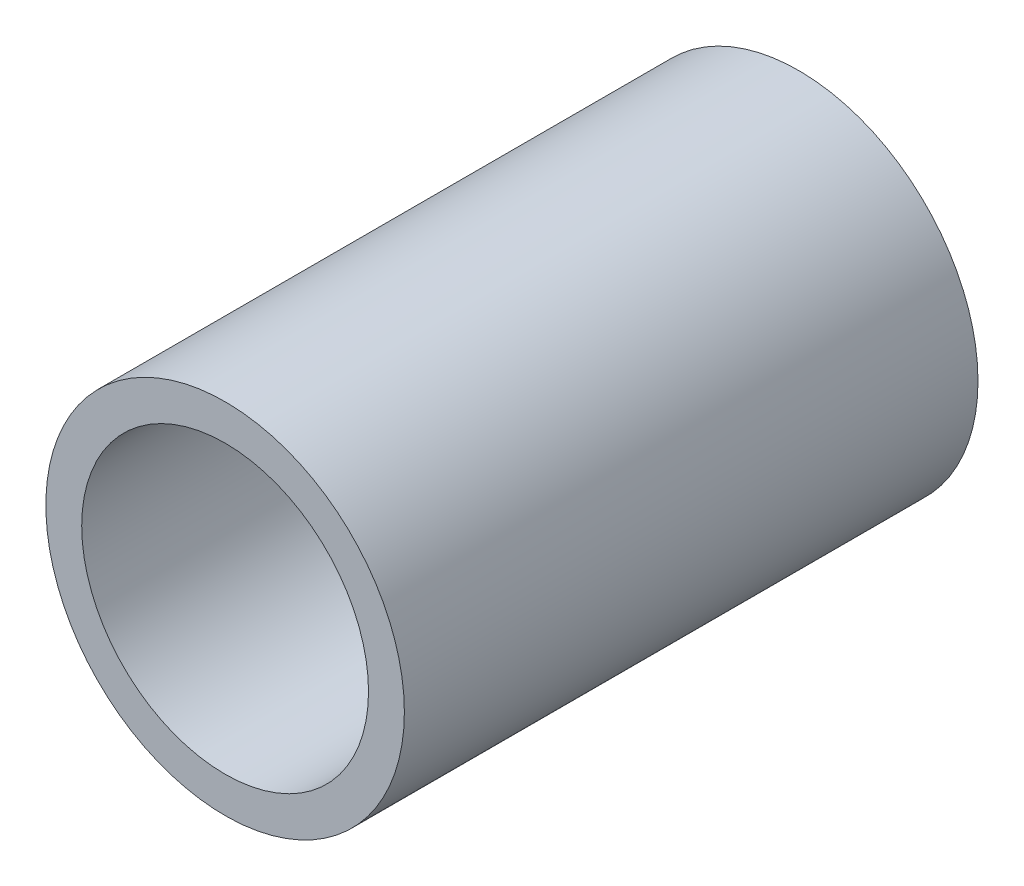
ISO-10303-21;
HEADER;
FILE_DESCRIPTION(('STEP AP214'),'2;1');
FILE_NAME('part.step','',(''),(''),'','','');
FILE_SCHEMA(('AUTOMOTIVE_DESIGN { 1 0 10303 214 1 1 1 1 }'));
ENDSEC;
DATA;
#1=APPLICATION_CONTEXT('core data for automotive mechanical design processes');
#2=APPLICATION_PROTOCOL_DEFINITION('international standard','automotive_design',2000,#1);
#3=PRODUCT_CONTEXT('',#1,'mechanical');
#4=PRODUCT('Part','Part','',(#3));
#5=PRODUCT_RELATED_PRODUCT_CATEGORY('part','',(#4));
#6=PRODUCT_DEFINITION_FORMATION('','',#4);
#7=PRODUCT_DEFINITION_CONTEXT('part definition',#1,'design');
#8=PRODUCT_DEFINITION('design','',#6,#7);
#9=PRODUCT_DEFINITION_SHAPE('','',#8);
#10=(LENGTH_UNIT() NAMED_UNIT(*) SI_UNIT(.MILLI.,.METRE.));
#11=(NAMED_UNIT(*) PLANE_ANGLE_UNIT() SI_UNIT($,.RADIAN.));
#12=(NAMED_UNIT(*) SI_UNIT($,.STERADIAN.) SOLID_ANGLE_UNIT());
#13=UNCERTAINTY_MEASURE_WITH_UNIT(LENGTH_MEASURE(1.E-05),#10,'distance_accuracy_value','');
#14=(GEOMETRIC_REPRESENTATION_CONTEXT(3) GLOBAL_UNCERTAINTY_ASSIGNED_CONTEXT((#13)) GLOBAL_UNIT_ASSIGNED_CONTEXT((#10,
#11,#12)) REPRESENTATION_CONTEXT('',''));
#15=CARTESIAN_POINT('',(0.,0.,0.));
#16=DIRECTION('',(0.,0.,1.));
#17=DIRECTION('',(1.,0.,0.));
#18=AXIS2_PLACEMENT_3D('',#15,#16,#17);
#19=CARTESIAN_POINT('',(0.,0.,12.));
#20=DIRECTION('',(0.,0.,1.));
#21=DIRECTION('',(1.,0.,0.));
#22=AXIS2_PLACEMENT_3D('',#19,#20,#21);
#23=PLANE('',#22);
#24=CARTESIAN_POINT('',(0.,0.,12.));
#25=DIRECTION('',(0.,0.,1.));
#26=DIRECTION('',(1.,0.,0.));
#27=AXIS2_PLACEMENT_3D('',#24,#25,#26);
#28=CIRCLE('',#27,7.5);
#29=CARTESIAN_POINT('',(7.5,0.,12.));
#30=VERTEX_POINT('',#29);
#31=EDGE_CURVE('E10',#30,#30,#28,.T.);
#32=ORIENTED_EDGE('',*,*,#31,.T.);
#33=EDGE_LOOP('',(#32));
#34=FACE_BOUND('',#33,.T.);
#35=CARTESIAN_POINT('',(0.,0.,12.));
#36=DIRECTION('',(0.,0.,1.));
#37=DIRECTION('',(1.,0.,0.));
#38=AXIS2_PLACEMENT_3D('',#35,#36,#37);
#39=CIRCLE('',#38,6.);
#40=CARTESIAN_POINT('',(6.,0.,12.));
#41=VERTEX_POINT('',#40);
#42=EDGE_CURVE('E50',#41,#41,#39,.T.);
#43=ORIENTED_EDGE('',*,*,#42,.F.);
#44=EDGE_LOOP('',(#43));
#45=FACE_BOUND('',#44,.T.);
#46=ADVANCED_FACE('F37',(#34,#45),#23,.T.);
#47=CARTESIAN_POINT('',(0.,0.,-12.));
#48=DIRECTION('',(0.,0.,1.));
#49=DIRECTION('',(1.,0.,0.));
#50=AXIS2_PLACEMENT_3D('',#47,#48,#49);
#51=PLANE('',#50);
#52=CARTESIAN_POINT('',(0.,0.,-12.));
#53=DIRECTION('',(0.,0.,1.));
#54=DIRECTION('',(1.,0.,0.));
#55=AXIS2_PLACEMENT_3D('',#52,#53,#54);
#56=CIRCLE('',#55,7.5);
#57=CARTESIAN_POINT('',(7.5,0.,-12.));
#58=VERTEX_POINT('',#57);
#59=EDGE_CURVE('E41',#58,#58,#56,.T.);
#60=ORIENTED_EDGE('',*,*,#59,.F.);
#61=EDGE_LOOP('',(#60));
#62=FACE_BOUND('',#61,.T.);
#63=CARTESIAN_POINT('',(0.,0.,-12.));
#64=DIRECTION('',(0.,0.,1.));
#65=DIRECTION('',(1.,0.,0.));
#66=AXIS2_PLACEMENT_3D('',#63,#64,#65);
#67=CIRCLE('',#66,6.);
#68=CARTESIAN_POINT('',(6.,0.,-12.));
#69=VERTEX_POINT('',#68);
#70=EDGE_CURVE('E52',#69,#69,#67,.T.);
#71=ORIENTED_EDGE('',*,*,#70,.T.);
#72=EDGE_LOOP('',(#71));
#73=FACE_BOUND('',#72,.T.);
#74=ADVANCED_FACE('F64',(#62,#73),#51,.F.);
#75=CARTESIAN_POINT('',(0.,0.,12.));
#76=DIRECTION('',(0.,0.,-1.));
#77=DIRECTION('',(-1.,0.,0.));
#78=AXIS2_PLACEMENT_3D('',#75,#76,#77);
#79=CYLINDRICAL_SURFACE('',#78,7.5);
#80=ORIENTED_EDGE('',*,*,#31,.F.);
#81=EDGE_LOOP('',(#80));
#82=FACE_BOUND('',#81,.T.);
#83=ORIENTED_EDGE('',*,*,#59,.T.);
#84=EDGE_LOOP('',(#83));
#85=FACE_BOUND('',#84,.T.);
#86=ADVANCED_FACE('F39',(#82,#85),#79,.T.);
#87=CARTESIAN_POINT('',(0.,0.,12.));
#88=DIRECTION('',(0.,0.,-1.));
#89=DIRECTION('',(-1.,0.,0.));
#90=AXIS2_PLACEMENT_3D('',#87,#88,#89);
#91=CYLINDRICAL_SURFACE('',#90,6.);
#92=ORIENTED_EDGE('',*,*,#42,.T.);
#93=EDGE_LOOP('',(#92));
#94=FACE_BOUND('',#93,.T.);
#95=ORIENTED_EDGE('',*,*,#70,.F.);
#96=EDGE_LOOP('',(#95));
#97=FACE_BOUND('',#96,.T.);
#98=ADVANCED_FACE('F60',(#94,#97),#91,.F.);
#99=CLOSED_SHELL('',(#46,#74,#86,#98));
#100=MANIFOLD_SOLID_BREP('B2',#99);
#101=ADVANCED_BREP_SHAPE_REPRESENTATION('',(#18,#100),#14);
#102=SHAPE_DEFINITION_REPRESENTATION(#9,#101);
ENDSEC;
END-ISO-10303-21;
